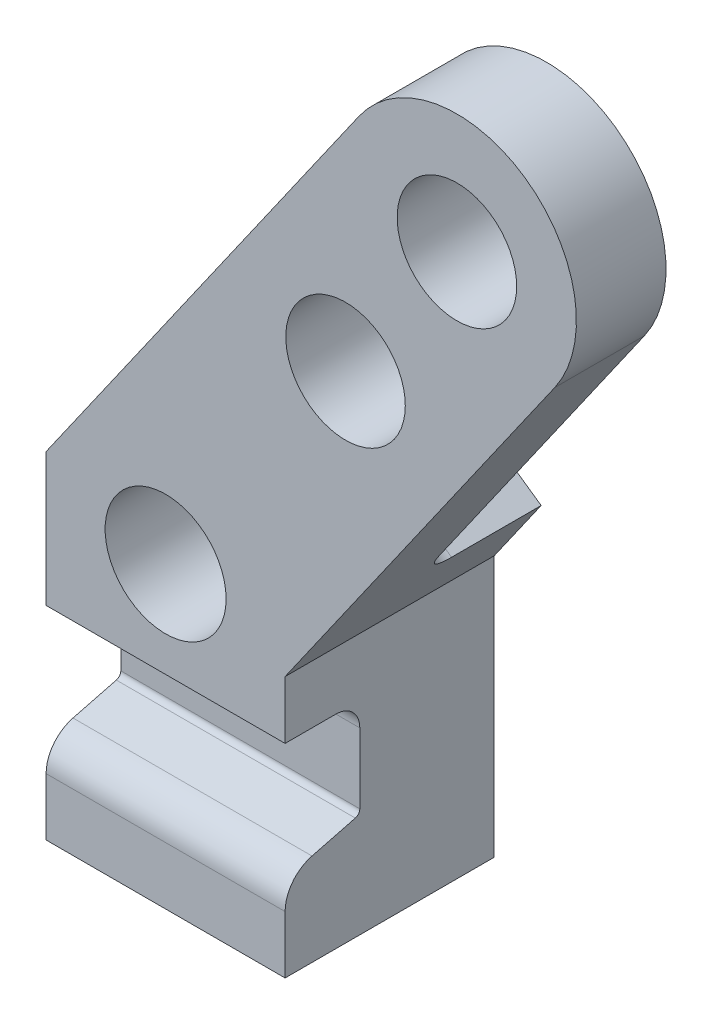
ISO-10303-21;
HEADER;
FILE_DESCRIPTION(('STEP AP214'),'2;1');
FILE_NAME('part.step','',(''),(''),'','','');
FILE_SCHEMA(('AUTOMOTIVE_DESIGN { 1 0 10303 214 1 1 1 1 }'));
ENDSEC;
DATA;
#1=APPLICATION_CONTEXT('core data for automotive mechanical design processes');
#2=APPLICATION_PROTOCOL_DEFINITION('international standard','automotive_design',2000,#1);
#3=PRODUCT_CONTEXT('',#1,'mechanical');
#4=PRODUCT('Part','Part','',(#3));
#5=PRODUCT_RELATED_PRODUCT_CATEGORY('part','',(#4));
#6=PRODUCT_DEFINITION_FORMATION('','',#4);
#7=PRODUCT_DEFINITION_CONTEXT('part definition',#1,'design');
#8=PRODUCT_DEFINITION('design','',#6,#7);
#9=PRODUCT_DEFINITION_SHAPE('','',#8);
#10=(LENGTH_UNIT() NAMED_UNIT(*) SI_UNIT(.MILLI.,.METRE.));
#11=(NAMED_UNIT(*) PLANE_ANGLE_UNIT() SI_UNIT($,.RADIAN.));
#12=(NAMED_UNIT(*) SI_UNIT($,.STERADIAN.) SOLID_ANGLE_UNIT());
#13=UNCERTAINTY_MEASURE_WITH_UNIT(LENGTH_MEASURE(1.E-05),#10,'distance_accuracy_value','');
#14=(GEOMETRIC_REPRESENTATION_CONTEXT(3) GLOBAL_UNCERTAINTY_ASSIGNED_CONTEXT((#13)) GLOBAL_UNIT_ASSIGNED_CONTEXT((#10,
#11,#12)) REPRESENTATION_CONTEXT('',''));
#15=CARTESIAN_POINT('',(0.,0.,0.));
#16=DIRECTION('',(0.,0.,1.));
#17=DIRECTION('',(1.,0.,0.));
#18=AXIS2_PLACEMENT_3D('',#15,#16,#17);
#19=CARTESIAN_POINT('',(97.5079941796775,139.255847529129,70.));
#20=DIRECTION('',(0.,0.,-1.));
#21=DIRECTION('',(-1.,0.,0.));
#22=AXIS2_PLACEMENT_3D('',#19,#20,#21);
#23=PLANE('',#22);
#24=DIRECTION('',(0.,1.,0.));
#25=VECTOR('',#24,1.);
#26=CARTESIAN_POINT('',(40.,-100.,70.));
#27=LINE('',#26,#25);
#28=CARTESIAN_POINT('',(40.,-100.,70.));
#29=VERTEX_POINT('',#28);
#30=CARTESIAN_POINT('',(40.,-80.7501322745768,70.));
#31=VERTEX_POINT('',#30);
#32=EDGE_CURVE('E181',#29,#31,#27,.T.);
#33=ORIENTED_EDGE('',*,*,#32,.T.);
#34=DIRECTION('',(-1.,0.,0.));
#35=VECTOR('',#34,1.);
#36=CARTESIAN_POINT('',(97.5079941796775,-80.7501322745768,70.));
#37=LINE('',#36,#35);
#38=CARTESIAN_POINT('',(-40.,-80.7501322745768,70.));
#39=VERTEX_POINT('',#38);
#40=EDGE_CURVE('E226',#31,#39,#37,.T.);
#41=ORIENTED_EDGE('',*,*,#40,.T.);
#42=DIRECTION('',(0.,-1.,0.));
#43=VECTOR('',#42,1.);
#44=CARTESIAN_POINT('',(-40.,12.6119515551592,70.));
#45=LINE('',#44,#43);
#46=CARTESIAN_POINT('',(-40.,-100.,70.));
#47=VERTEX_POINT('',#46);
#48=EDGE_CURVE('E174',#39,#47,#45,.T.);
#49=ORIENTED_EDGE('',*,*,#48,.T.);
#50=DIRECTION('',(1.,0.,0.));
#51=VECTOR('',#50,1.);
#52=CARTESIAN_POINT('',(-40.,-100.,70.));
#53=LINE('',#52,#51);
#54=EDGE_CURVE('E173',#47,#29,#53,.T.);
#55=ORIENTED_EDGE('',*,*,#54,.T.);
#56=EDGE_LOOP('',(#33,#41,#49,#55));
#57=FACE_BOUND('',#56,.T.);
#58=ADVANCED_FACE('F34',(#57),#23,.F.);
#59=CARTESIAN_POINT('',(97.5079941796775,139.255847529129,0.));
#60=DIRECTION('',(0.,0.,-1.));
#61=DIRECTION('',(-1.,0.,0.));
#62=AXIS2_PLACEMENT_3D('',#59,#60,#61);
#63=PLANE('',#62);
#64=CARTESIAN_POINT('',(0.,0.,0.));
#65=DIRECTION('',(0.,0.,1.));
#66=DIRECTION('',(1.,0.,0.));
#67=AXIS2_PLACEMENT_3D('',#64,#65,#66);
#68=CIRCLE('',#67,20.25);
#69=CARTESIAN_POINT('',(20.25,0.,0.));
#70=VERTEX_POINT('',#69);
#71=EDGE_CURVE('E288',#70,#70,#68,.T.);
#72=ORIENTED_EDGE('',*,*,#71,.T.);
#73=EDGE_LOOP('',(#72));
#74=FACE_BOUND('',#73,.T.);
#75=DIRECTION('',(-0.573576436351044,-0.819152044288993,0.));
#76=VECTOR('',#75,1.);
#77=CARTESIAN_POINT('',(64.7419124081177,162.198904983171,0.));
#78=LINE('',#77,#76);
#79=CARTESIAN_POINT('',(-9.823024317518,55.7091392256015,0.));
#80=VERTEX_POINT('',#79);
#81=CARTESIAN_POINT('',(-40.,12.6119515551592,0.));
#82=VERTEX_POINT('',#81);
#83=EDGE_CURVE('E187',#80,#82,#78,.T.);
#84=ORIENTED_EDGE('',*,*,#83,.F.);
#85=DIRECTION('',(0.819152044288994,-0.573576436351044,0.));
#86=VECTOR('',#85,1.);
#87=CARTESIAN_POINT('',(-9.823024317518,55.7091392256015,0.));
#88=LINE('',#87,#86);
#89=CARTESIAN_POINT('',(55.7091392256015,9.82302431751797,0.));
#90=VERTEX_POINT('',#89);
#91=EDGE_CURVE('E155',#80,#90,#88,.T.);
#92=ORIENTED_EDGE('',*,*,#91,.T.);
#93=DIRECTION('',(0.573576436351044,0.819152044288993,0.));
#94=VECTOR('',#93,1.);
#95=CARTESIAN_POINT('',(130.274075951237,116.312790075087,0.));
#96=LINE('',#95,#94);
#97=CARTESIAN_POINT('',(40.,-12.6119515551593,0.));
#98=VERTEX_POINT('',#97);
#99=EDGE_CURVE('E196',#98,#90,#96,.T.);
#100=ORIENTED_EDGE('',*,*,#99,.F.);
#101=DIRECTION('',(0.,1.,0.));
#102=VECTOR('',#101,1.);
#103=CARTESIAN_POINT('',(40.,-100.,0.));
#104=LINE('',#103,#102);
#105=CARTESIAN_POINT('',(40.,-100.,0.));
#106=VERTEX_POINT('',#105);
#107=EDGE_CURVE('E194',#106,#98,#104,.T.);
#108=ORIENTED_EDGE('',*,*,#107,.F.);
#109=DIRECTION('',(1.,0.,0.));
#110=VECTOR('',#109,1.);
#111=CARTESIAN_POINT('',(-40.,-100.,0.));
#112=LINE('',#111,#110);
#113=CARTESIAN_POINT('',(-40.,-100.,0.));
#114=VERTEX_POINT('',#113);
#115=EDGE_CURVE('E192',#114,#106,#112,.T.);
#116=ORIENTED_EDGE('',*,*,#115,.F.);
#117=DIRECTION('',(0.,-1.,0.));
#118=VECTOR('',#117,1.);
#119=CARTESIAN_POINT('',(-40.,12.6119515551592,0.));
#120=LINE('',#119,#118);
#121=EDGE_CURVE('E189',#82,#114,#120,.T.);
#122=ORIENTED_EDGE('',*,*,#121,.F.);
#123=EDGE_LOOP('',(#84,#92,#100,#108,#116,#122));
#124=FACE_BOUND('',#123,.T.);
#125=ADVANCED_FACE('F306',(#74,#124),#63,.T.);
#126=CARTESIAN_POINT('',(64.7419124081177,162.198904983171,70.));
#127=DIRECTION('',(0.819152044288993,-0.573576436351044,0.));
#128=DIRECTION('',(0.573576436351044,0.819152044288993,0.));
#129=AXIS2_PLACEMENT_3D('',#126,#127,#128);
#130=PLANE('',#129);
#131=DIRECTION('',(-0.573576436351044,-0.819152044288993,0.));
#132=VECTOR('',#131,1.);
#133=CARTESIAN_POINT('',(104.892262952691,219.5395480834,40.));
#134=LINE('',#133,#132);
#135=CARTESIAN_POINT('',(64.7419124081177,162.198904983171,40.));
#136=VERTEX_POINT('',#135);
#137=CARTESIAN_POINT('',(-4.08725995400756,63.9006596684914,40.));
#138=VERTEX_POINT('',#137);
#139=EDGE_CURVE('E273',#136,#138,#134,.T.);
#140=ORIENTED_EDGE('',*,*,#139,.T.);
#141=CARTESIAN_POINT('',(-4.08725995400754,63.9006596684914,30.));
#142=DIRECTION('',(0.819152044288993,-0.573576436351044,0.));
#143=DIRECTION('',(0.573576436351044,0.819152044288993,0.));
#144=AXIS2_PLACEMENT_3D('',#141,#142,#143);
#145=CIRCLE('',#144,10.);
#146=CARTESIAN_POINT('',(-9.823024317518,55.7091392256015,30.));
#147=VERTEX_POINT('',#146);
#148=EDGE_CURVE('E11',#138,#147,#145,.T.);
#149=ORIENTED_EDGE('',*,*,#148,.T.);
#150=DIRECTION('',(0.,0.,-1.));
#151=VECTOR('',#150,1.);
#152=CARTESIAN_POINT('',(-9.823024317518,55.7091392256015,40.));
#153=LINE('',#152,#151);
#154=EDGE_CURVE('E220',#147,#80,#153,.T.);
#155=ORIENTED_EDGE('',*,*,#154,.T.);
#156=ORIENTED_EDGE('',*,*,#83,.T.);
#157=DIRECTION('',(0.,0.,-1.));
#158=VECTOR('',#157,1.);
#159=CARTESIAN_POINT('',(-40.,12.6119515551592,70.));
#160=LINE('',#159,#158);
#161=CARTESIAN_POINT('',(-40.,12.6119515551592,70.));
#162=VERTEX_POINT('',#161);
#163=EDGE_CURVE('E211',#162,#82,#160,.T.);
#164=ORIENTED_EDGE('',*,*,#163,.F.);
#165=DIRECTION('',(-0.573576436351044,-0.819152044288993,0.));
#166=VECTOR('',#165,1.);
#167=CARTESIAN_POINT('',(64.7419124081177,162.198904983171,70.));
#168=LINE('',#167,#166);
#169=CARTESIAN_POINT('',(64.7419124081177,162.198904983171,70.));
#170=VERTEX_POINT('',#169);
#171=EDGE_CURVE('E171',#170,#162,#168,.T.);
#172=ORIENTED_EDGE('',*,*,#171,.F.);
#173=DIRECTION('',(0.,0.,-1.));
#174=VECTOR('',#173,1.);
#175=CARTESIAN_POINT('',(64.7419124081177,162.198904983171,70.));
#176=LINE('',#175,#174);
#177=EDGE_CURVE('E213',#170,#136,#176,.T.);
#178=ORIENTED_EDGE('',*,*,#177,.T.);
#179=EDGE_LOOP('',(#140,#149,#155,#156,#164,#172,#178));
#180=FACE_BOUND('',#179,.T.);
#181=ADVANCED_FACE('F300',(#180),#130,.F.);
#182=CARTESIAN_POINT('',(130.274075951237,116.312790075087,70.));
#183=DIRECTION('',(-0.819152044288993,0.573576436351044,0.));
#184=DIRECTION('',(-0.573576436351044,-0.819152044288993,0.));
#185=AXIS2_PLACEMENT_3D('',#182,#183,#184);
#186=PLANE('',#185);
#187=DIRECTION('',(0.,0.,-1.));
#188=VECTOR('',#187,1.);
#189=CARTESIAN_POINT('',(55.7091392256015,9.82302431751797,40.));
#190=LINE('',#189,#188);
#191=CARTESIAN_POINT('',(55.7091392256015,9.82302431751797,30.));
#192=VERTEX_POINT('',#191);
#193=EDGE_CURVE('E264',#192,#90,#190,.T.);
#194=ORIENTED_EDGE('',*,*,#193,.F.);
#195=CARTESIAN_POINT('',(61.444903589112,18.0145447604079,30.));
#196=DIRECTION('',(-0.819152044288993,0.573576436351044,0.));
#197=DIRECTION('',(-0.573576436351044,-0.819152044288993,0.));
#198=AXIS2_PLACEMENT_3D('',#195,#196,#197);
#199=CIRCLE('',#198,10.);
#200=CARTESIAN_POINT('',(61.4449035891119,18.0145447604079,40.));
#201=VERTEX_POINT('',#200);
#202=EDGE_CURVE('E42',#192,#201,#199,.T.);
#203=ORIENTED_EDGE('',*,*,#202,.T.);
#204=DIRECTION('',(0.573576436351044,0.819152044288993,0.));
#205=VECTOR('',#204,1.);
#206=CARTESIAN_POINT('',(55.7091392256015,9.82302431751797,40.));
#207=LINE('',#206,#205);
#208=CARTESIAN_POINT('',(130.274075951237,116.312790075087,40.));
#209=VERTEX_POINT('',#208);
#210=EDGE_CURVE('E270',#201,#209,#207,.T.);
#211=ORIENTED_EDGE('',*,*,#210,.T.);
#212=DIRECTION('',(0.,0.,-1.));
#213=VECTOR('',#212,1.);
#214=CARTESIAN_POINT('',(130.274075951237,116.312790075087,70.));
#215=LINE('',#214,#213);
#216=CARTESIAN_POINT('',(130.274075951237,116.312790075087,70.));
#217=VERTEX_POINT('',#216);
#218=EDGE_CURVE('E186',#217,#209,#215,.T.);
#219=ORIENTED_EDGE('',*,*,#218,.F.);
#220=DIRECTION('',(0.573576436351044,0.819152044288993,0.));
#221=VECTOR('',#220,1.);
#222=CARTESIAN_POINT('',(130.274075951237,116.312790075087,70.));
#223=LINE('',#222,#221);
#224=CARTESIAN_POINT('',(40.,-12.6119515551593,70.));
#225=VERTEX_POINT('',#224);
#226=EDGE_CURVE('E184',#225,#217,#223,.T.);
#227=ORIENTED_EDGE('',*,*,#226,.F.);
#228=DIRECTION('',(0.,0.,-1.));
#229=VECTOR('',#228,1.);
#230=CARTESIAN_POINT('',(40.,-12.6119515551593,70.));
#231=LINE('',#230,#229);
#232=EDGE_CURVE('E202',#225,#98,#231,.T.);
#233=ORIENTED_EDGE('',*,*,#232,.T.);
#234=ORIENTED_EDGE('',*,*,#99,.T.);
#235=EDGE_LOOP('',(#194,#203,#211,#219,#227,#233,#234));
#236=FACE_BOUND('',#235,.T.);
#237=ADVANCED_FACE('F268',(#236),#186,.F.);
#238=CARTESIAN_POINT('',(97.5079941796775,139.255847529129,70.));
#239=DIRECTION('',(0.,0.,1.));
#240=DIRECTION('',(1.,0.,0.));
#241=AXIS2_PLACEMENT_3D('',#238,#239,#240);
#242=CIRCLE('',#241,20.);
#243=CARTESIAN_POINT('',(117.507994179677,139.255847529129,70.));
#244=VERTEX_POINT('',#243);
#245=EDGE_CURVE('E285',#244,#244,#242,.T.);
#246=ORIENTED_EDGE('',*,*,#245,.F.);
#247=EDGE_LOOP('',(#246));
#248=FACE_BOUND('',#247,.T.);
#249=CARTESIAN_POINT('',(-40.,-32.,70.));
#250=VERTEX_POINT('',#249);
#251=EDGE_CURVE('E163',#162,#250,#45,.T.);
#252=ORIENTED_EDGE('',*,*,#251,.T.);
#253=DIRECTION('',(-1.,0.,0.));
#254=VECTOR('',#253,1.);
#255=CARTESIAN_POINT('',(137.507994179677,-32.,70.));
#256=LINE('',#255,#254);
#257=CARTESIAN_POINT('',(40.,-32.,70.));
#258=VERTEX_POINT('',#257);
#259=EDGE_CURVE('E145',#258,#250,#256,.T.);
#260=ORIENTED_EDGE('',*,*,#259,.F.);
#261=EDGE_CURVE('E176',#258,#225,#27,.T.);
#262=ORIENTED_EDGE('',*,*,#261,.T.);
#263=ORIENTED_EDGE('',*,*,#226,.T.);
#264=CARTESIAN_POINT('',(97.5079941796775,139.255847529129,70.));
#265=DIRECTION('',(0.,0.,1.));
#266=DIRECTION('',(-1.,0.,0.));
#267=AXIS2_PLACEMENT_3D('',#264,#265,#266);
#268=CIRCLE('',#267,40.);
#269=EDGE_CURVE('E199',#217,#170,#268,.T.);
#270=ORIENTED_EDGE('',*,*,#269,.T.);
#271=ORIENTED_EDGE('',*,*,#171,.T.);
#272=EDGE_LOOP('',(#252,#260,#262,#263,#270,#271));
#273=FACE_BOUND('',#272,.T.);
#274=CARTESIAN_POINT('',(0.,0.,70.));
#275=DIRECTION('',(0.,0.,1.));
#276=DIRECTION('',(1.,0.,0.));
#277=AXIS2_PLACEMENT_3D('',#274,#275,#276);
#278=CIRCLE('',#277,20.25);
#279=CARTESIAN_POINT('',(20.25,0.,70.));
#280=VERTEX_POINT('',#279);
#281=EDGE_CURVE('E190',#280,#280,#278,.T.);
#282=ORIENTED_EDGE('',*,*,#281,.F.);
#283=EDGE_LOOP('',(#282));
#284=FACE_BOUND('',#283,.T.);
#285=CARTESIAN_POINT('',(60.2255258168596,86.0109646503443,70.));
#286=DIRECTION('',(0.,0.,1.));
#287=DIRECTION('',(1.,0.,0.));
#288=AXIS2_PLACEMENT_3D('',#285,#286,#287);
#289=CIRCLE('',#288,20.);
#290=CARTESIAN_POINT('',(80.2255258168596,86.0109646503443,70.));
#291=VERTEX_POINT('',#290);
#292=EDGE_CURVE('E282',#291,#291,#289,.T.);
#293=ORIENTED_EDGE('',*,*,#292,.F.);
#294=EDGE_LOOP('',(#293));
#295=FACE_BOUND('',#294,.T.);
#296=ADVANCED_FACE('F168',(#248,#273,#284,#295),#23,.F.);
#297=CARTESIAN_POINT('',(97.5079941796775,139.255847529129,70.));
#298=DIRECTION('',(0.,0.,-1.));
#299=DIRECTION('',(-1.,0.,0.));
#300=AXIS2_PLACEMENT_3D('',#297,#298,#299);
#301=CYLINDRICAL_SURFACE('',#300,40.);
#302=ORIENTED_EDGE('',*,*,#218,.T.);
#303=CARTESIAN_POINT('',(97.5079941796775,139.255847529129,40.));
#304=DIRECTION('',(0.,0.,1.));
#305=DIRECTION('',(1.,0.,0.));
#306=AXIS2_PLACEMENT_3D('',#303,#304,#305);
#307=CIRCLE('',#306,40.);
#308=EDGE_CURVE('E279',#209,#136,#307,.T.);
#309=ORIENTED_EDGE('',*,*,#308,.T.);
#310=ORIENTED_EDGE('',*,*,#177,.F.);
#311=ORIENTED_EDGE('',*,*,#269,.F.);
#312=EDGE_LOOP('',(#302,#309,#310,#311));
#313=FACE_BOUND('',#312,.T.);
#314=ADVANCED_FACE('F297',(#313),#301,.T.);
#315=CARTESIAN_POINT('',(-40.,12.6119515551592,70.));
#316=DIRECTION('',(1.,0.,0.));
#317=DIRECTION('',(0.,1.,0.));
#318=AXIS2_PLACEMENT_3D('',#315,#316,#317);
#319=PLANE('',#318);
#320=ORIENTED_EDGE('',*,*,#48,.F.);
#321=CARTESIAN_POINT('',(-40.,-80.7501322745768,58.));
#322=DIRECTION('',(1.,0.,0.));
#323=DIRECTION('',(0.,1.,0.));
#324=AXIS2_PLACEMENT_3D('',#321,#322,#323);
#325=CIRCLE('',#324,12.);
#326=CARTESIAN_POINT('',(-40.,-69.1311822359546,61.));
#327=VERTEX_POINT('',#326);
#328=EDGE_CURVE('E229',#39,#327,#325,.F.);
#329=ORIENTED_EDGE('',*,*,#328,.T.);
#330=DIRECTION('',(0.,-0.250000000000001,0.968245836551854));
#331=VECTOR('',#330,1.);
#332=CARTESIAN_POINT('',(-40.,-65.,45.));
#333=LINE('',#332,#331);
#334=CARTESIAN_POINT('',(-40.,-65.3872983346207,46.5));
#335=VERTEX_POINT('',#334);
#336=EDGE_CURVE('E156',#335,#327,#333,.T.);
#337=ORIENTED_EDGE('',*,*,#336,.F.);
#338=CARTESIAN_POINT('',(-40.,-63.450806661517,47.));
#339=DIRECTION('',(1.,0.,0.));
#340=DIRECTION('',(0.,1.,0.));
#341=AXIS2_PLACEMENT_3D('',#338,#339,#340);
#342=CIRCLE('',#341,2.);
#343=CARTESIAN_POINT('',(-40.,-63.450806661517,45.));
#344=VERTEX_POINT('',#343);
#345=EDGE_CURVE('E243',#335,#344,#342,.T.);
#346=ORIENTED_EDGE('',*,*,#345,.T.);
#347=DIRECTION('',(0.,-1.,0.));
#348=VECTOR('',#347,1.);
#349=CARTESIAN_POINT('',(-40.,-32.,45.));
#350=LINE('',#349,#348);
#351=CARTESIAN_POINT('',(-40.,-40.,45.));
#352=VERTEX_POINT('',#351);
#353=EDGE_CURVE('E166',#352,#344,#350,.T.);
#354=ORIENTED_EDGE('',*,*,#353,.F.);
#355=CARTESIAN_POINT('',(-40.,-40.,53.));
#356=DIRECTION('',(1.,0.,0.));
#357=DIRECTION('',(0.,1.,0.));
#358=AXIS2_PLACEMENT_3D('',#355,#356,#357);
#359=CIRCLE('',#358,8.);
#360=CARTESIAN_POINT('',(-40.,-32.,53.));
#361=VERTEX_POINT('',#360);
#362=EDGE_CURVE('E165',#352,#361,#359,.T.);
#363=ORIENTED_EDGE('',*,*,#362,.T.);
#364=DIRECTION('',(0.,0.,-1.));
#365=VECTOR('',#364,1.);
#366=CARTESIAN_POINT('',(-40.,-32.,70.));
#367=LINE('',#366,#365);
#368=EDGE_CURVE('E148',#250,#361,#367,.T.);
#369=ORIENTED_EDGE('',*,*,#368,.F.);
#370=ORIENTED_EDGE('',*,*,#251,.F.);
#371=ORIENTED_EDGE('',*,*,#163,.T.);
#372=ORIENTED_EDGE('',*,*,#121,.T.);
#373=DIRECTION('',(0.,0.,-1.));
#374=VECTOR('',#373,1.);
#375=CARTESIAN_POINT('',(-40.,-100.,70.));
#376=LINE('',#375,#374);
#377=EDGE_CURVE('E208',#47,#114,#376,.T.);
#378=ORIENTED_EDGE('',*,*,#377,.F.);
#379=EDGE_LOOP('',(#320,#329,#337,#346,#354,#363,#369,#370,#371,#372,#378));
#380=FACE_BOUND('',#379,.T.);
#381=ADVANCED_FACE('F161',(#380),#319,.F.);
#382=CARTESIAN_POINT('',(-40.,-100.,70.));
#383=DIRECTION('',(0.,1.,0.));
#384=DIRECTION('',(0.,0.,1.));
#385=AXIS2_PLACEMENT_3D('',#382,#383,#384);
#386=PLANE('',#385);
#387=ORIENTED_EDGE('',*,*,#115,.T.);
#388=DIRECTION('',(0.,0.,-1.));
#389=VECTOR('',#388,1.);
#390=CARTESIAN_POINT('',(40.,-100.,70.));
#391=LINE('',#390,#389);
#392=EDGE_CURVE('E205',#29,#106,#391,.T.);
#393=ORIENTED_EDGE('',*,*,#392,.F.);
#394=ORIENTED_EDGE('',*,*,#54,.F.);
#395=ORIENTED_EDGE('',*,*,#377,.T.);
#396=EDGE_LOOP('',(#387,#393,#394,#395));
#397=FACE_BOUND('',#396,.T.);
#398=ADVANCED_FACE('F310',(#397),#386,.F.);
#399=CARTESIAN_POINT('',(40.,-100.,70.));
#400=DIRECTION('',(-1.,0.,0.));
#401=DIRECTION('',(0.,-1.,0.));
#402=AXIS2_PLACEMENT_3D('',#399,#400,#401);
#403=PLANE('',#402);
#404=DIRECTION('',(0.,0.,-1.));
#405=VECTOR('',#404,1.);
#406=CARTESIAN_POINT('',(40.,-32.,70.));
#407=LINE('',#406,#405);
#408=CARTESIAN_POINT('',(40.,-32.,53.));
#409=VERTEX_POINT('',#408);
#410=EDGE_CURVE('E151',#258,#409,#407,.T.);
#411=ORIENTED_EDGE('',*,*,#410,.T.);
#412=CARTESIAN_POINT('',(40.,-40.,53.));
#413=DIRECTION('',(-1.,0.,0.));
#414=DIRECTION('',(0.,-1.,0.));
#415=AXIS2_PLACEMENT_3D('',#412,#413,#414);
#416=CIRCLE('',#415,8.);
#417=CARTESIAN_POINT('',(40.,-40.,45.));
#418=VERTEX_POINT('',#417);
#419=EDGE_CURVE('E254',#409,#418,#416,.T.);
#420=ORIENTED_EDGE('',*,*,#419,.T.);
#421=DIRECTION('',(0.,-1.,0.));
#422=VECTOR('',#421,1.);
#423=CARTESIAN_POINT('',(40.,-100.,45.));
#424=LINE('',#423,#422);
#425=CARTESIAN_POINT('',(40.,-63.450806661517,45.));
#426=VERTEX_POINT('',#425);
#427=EDGE_CURVE('E222',#418,#426,#424,.T.);
#428=ORIENTED_EDGE('',*,*,#427,.T.);
#429=CARTESIAN_POINT('',(40.,-63.450806661517,47.));
#430=DIRECTION('',(-1.,0.,0.));
#431=DIRECTION('',(0.,-1.,0.));
#432=AXIS2_PLACEMENT_3D('',#429,#430,#431);
#433=CIRCLE('',#432,2.);
#434=CARTESIAN_POINT('',(40.,-65.3872983346207,46.5));
#435=VERTEX_POINT('',#434);
#436=EDGE_CURVE('E246',#426,#435,#433,.T.);
#437=ORIENTED_EDGE('',*,*,#436,.T.);
#438=DIRECTION('',(0.,-0.250000000000001,0.968245836551854));
#439=VECTOR('',#438,1.);
#440=CARTESIAN_POINT('',(40.,-73.2390364784491,76.9096510698288));
#441=LINE('',#440,#439);
#442=CARTESIAN_POINT('',(40.,-69.1311822359546,61.));
#443=VERTEX_POINT('',#442);
#444=EDGE_CURVE('E224',#435,#443,#441,.T.);
#445=ORIENTED_EDGE('',*,*,#444,.T.);
#446=CARTESIAN_POINT('',(40.,-80.7501322745768,58.));
#447=DIRECTION('',(-1.,0.,0.));
#448=DIRECTION('',(0.,-1.,0.));
#449=AXIS2_PLACEMENT_3D('',#446,#447,#448);
#450=CIRCLE('',#449,12.);
#451=EDGE_CURVE('E235',#443,#31,#450,.F.);
#452=ORIENTED_EDGE('',*,*,#451,.T.);
#453=ORIENTED_EDGE('',*,*,#32,.F.);
#454=ORIENTED_EDGE('',*,*,#392,.T.);
#455=ORIENTED_EDGE('',*,*,#107,.T.);
#456=ORIENTED_EDGE('',*,*,#232,.F.);
#457=ORIENTED_EDGE('',*,*,#261,.F.);
#458=EDGE_LOOP('',(#411,#420,#428,#437,#445,#452,#453,#454,#455,#456,#457));
#459=FACE_BOUND('',#458,.T.);
#460=ADVANCED_FACE('F314',(#459),#403,.F.);
#461=CARTESIAN_POINT('',(0.,0.,70.));
#462=DIRECTION('',(0.,0.,-1.));
#463=DIRECTION('',(-1.,0.,0.));
#464=AXIS2_PLACEMENT_3D('',#461,#462,#463);
#465=CYLINDRICAL_SURFACE('',#464,20.25);
#466=ORIENTED_EDGE('',*,*,#281,.T.);
#467=EDGE_LOOP('',(#466));
#468=FACE_BOUND('',#467,.T.);
#469=ORIENTED_EDGE('',*,*,#71,.F.);
#470=EDGE_LOOP('',(#469));
#471=FACE_BOUND('',#470,.T.);
#472=ADVANCED_FACE('F371',(#468,#471),#465,.F.);
#473=CARTESIAN_POINT('',(97.5079941796775,139.255847529129,70.));
#474=DIRECTION('',(0.,0.,-1.));
#475=DIRECTION('',(-1.,0.,0.));
#476=AXIS2_PLACEMENT_3D('',#473,#474,#475);
#477=CYLINDRICAL_SURFACE('',#476,20.);
#478=CARTESIAN_POINT('',(97.5079941796775,139.255847529129,40.));
#479=DIRECTION('',(0.,0.,1.));
#480=DIRECTION('',(1.,0.,0.));
#481=AXIS2_PLACEMENT_3D('',#478,#479,#480);
#482=CIRCLE('',#481,20.);
#483=CARTESIAN_POINT('',(117.507994179677,139.255847529129,40.));
#484=VERTEX_POINT('',#483);
#485=EDGE_CURVE('E219',#484,#484,#482,.T.);
#486=ORIENTED_EDGE('',*,*,#485,.F.);
#487=EDGE_LOOP('',(#486));
#488=FACE_BOUND('',#487,.T.);
#489=ORIENTED_EDGE('',*,*,#245,.T.);
#490=EDGE_LOOP('',(#489));
#491=FACE_BOUND('',#490,.T.);
#492=ADVANCED_FACE('F347',(#488,#491),#477,.F.);
#493=CARTESIAN_POINT('',(60.2255258168596,86.0109646503443,70.));
#494=DIRECTION('',(0.,0.,-1.));
#495=DIRECTION('',(-1.,0.,0.));
#496=AXIS2_PLACEMENT_3D('',#493,#494,#495);
#497=CYLINDRICAL_SURFACE('',#496,20.);
#498=CARTESIAN_POINT('',(60.2255258168596,86.0109646503443,40.));
#499=DIRECTION('',(0.,0.,1.));
#500=DIRECTION('',(1.,0.,0.));
#501=AXIS2_PLACEMENT_3D('',#498,#499,#500);
#502=CIRCLE('',#501,20.);
#503=CARTESIAN_POINT('',(80.2255258168596,86.0109646503443,40.));
#504=VERTEX_POINT('',#503);
#505=EDGE_CURVE('E216',#504,#504,#502,.T.);
#506=ORIENTED_EDGE('',*,*,#505,.F.);
#507=EDGE_LOOP('',(#506));
#508=FACE_BOUND('',#507,.T.);
#509=ORIENTED_EDGE('',*,*,#292,.T.);
#510=EDGE_LOOP('',(#509));
#511=FACE_BOUND('',#510,.T.);
#512=ADVANCED_FACE('F338',(#508,#511),#497,.F.);
#513=CARTESIAN_POINT('',(0.,0.,40.));
#514=DIRECTION('',(0.,0.,1.));
#515=DIRECTION('',(1.,0.,0.));
#516=AXIS2_PLACEMENT_3D('',#513,#514,#515);
#517=PLANE('',#516);
#518=ORIENTED_EDGE('',*,*,#505,.T.);
#519=EDGE_LOOP('',(#518));
#520=FACE_BOUND('',#519,.T.);
#521=ORIENTED_EDGE('',*,*,#485,.T.);
#522=EDGE_LOOP('',(#521));
#523=FACE_BOUND('',#522,.T.);
#524=ORIENTED_EDGE('',*,*,#210,.F.);
#525=DIRECTION('',(0.819152044288994,-0.573576436351044,0.));
#526=VECTOR('',#525,1.);
#527=CARTESIAN_POINT('',(28.6788218175522,40.9576022144497,40.));
#528=LINE('',#527,#526);
#529=EDGE_CURVE('E49',#201,#138,#528,.F.);
#530=ORIENTED_EDGE('',*,*,#529,.T.);
#531=ORIENTED_EDGE('',*,*,#139,.F.);
#532=ORIENTED_EDGE('',*,*,#308,.F.);
#533=EDGE_LOOP('',(#524,#530,#531,#532));
#534=FACE_BOUND('',#533,.T.);
#535=ADVANCED_FACE('F336',(#520,#523,#534),#517,.F.);
#536=CARTESIAN_POINT('',(-9.823024317518,55.7091392256015,40.));
#537=DIRECTION('',(0.573576436351044,0.819152044288994,0.));
#538=DIRECTION('',(-0.819152044288994,0.573576436351044,0.));
#539=AXIS2_PLACEMENT_3D('',#536,#537,#538);
#540=PLANE('',#539);
#541=ORIENTED_EDGE('',*,*,#154,.F.);
#542=DIRECTION('',(0.819152044288994,-0.573576436351044,0.));
#543=VECTOR('',#542,1.);
#544=CARTESIAN_POINT('',(-9.823024317518,55.7091392256015,30.));
#545=LINE('',#544,#543);
#546=EDGE_CURVE('E256',#147,#192,#545,.T.);
#547=ORIENTED_EDGE('',*,*,#546,.T.);
#548=ORIENTED_EDGE('',*,*,#193,.T.);
#549=ORIENTED_EDGE('',*,*,#91,.F.);
#550=EDGE_LOOP('',(#541,#547,#548,#549));
#551=FACE_BOUND('',#550,.T.);
#552=ADVANCED_FACE('F262',(#551),#540,.T.);
#553=CARTESIAN_POINT('',(137.507994179677,-65.,45.));
#554=DIRECTION('',(0.,-0.968245836551854,-0.250000000000001));
#555=DIRECTION('',(0.,0.250000000000001,-0.968245836551854));
#556=AXIS2_PLACEMENT_3D('',#553,#554,#555);
#557=PLANE('',#556);
#558=ORIENTED_EDGE('',*,*,#444,.F.);
#559=DIRECTION('',(-1.,0.,0.));
#560=VECTOR('',#559,1.);
#561=CARTESIAN_POINT('',(-39.9999999999999,-65.3872983346207,46.5));
#562=LINE('',#561,#560);
#563=EDGE_CURVE('E237',#435,#335,#562,.T.);
#564=ORIENTED_EDGE('',*,*,#563,.T.);
#565=ORIENTED_EDGE('',*,*,#336,.T.);
#566=DIRECTION('',(-1.,0.,0.));
#567=VECTOR('',#566,1.);
#568=CARTESIAN_POINT('',(137.507994179677,-69.1311822359546,61.));
#569=LINE('',#568,#567);
#570=EDGE_CURVE('E232',#327,#443,#569,.F.);
#571=ORIENTED_EDGE('',*,*,#570,.T.);
#572=EDGE_LOOP('',(#558,#564,#565,#571));
#573=FACE_BOUND('',#572,.T.);
#574=ADVANCED_FACE('F345',(#573),#557,.F.);
#575=CARTESIAN_POINT('',(137.507994179677,-32.,45.));
#576=DIRECTION('',(0.,0.,-1.));
#577=DIRECTION('',(0.,1.,0.));
#578=AXIS2_PLACEMENT_3D('',#575,#576,#577);
#579=PLANE('',#578);
#580=ORIENTED_EDGE('',*,*,#427,.F.);
#581=DIRECTION('',(-1.,0.,0.));
#582=VECTOR('',#581,1.);
#583=CARTESIAN_POINT('',(-40.,-40.,45.));
#584=LINE('',#583,#582);
#585=EDGE_CURVE('E248',#418,#352,#584,.T.);
#586=ORIENTED_EDGE('',*,*,#585,.T.);
#587=ORIENTED_EDGE('',*,*,#353,.T.);
#588=DIRECTION('',(-1.,0.,0.));
#589=VECTOR('',#588,1.);
#590=CARTESIAN_POINT('',(40.,-63.450806661517,45.));
#591=LINE('',#590,#589);
#592=EDGE_CURVE('E240',#344,#426,#591,.F.);
#593=ORIENTED_EDGE('',*,*,#592,.T.);
#594=EDGE_LOOP('',(#580,#586,#587,#593));
#595=FACE_BOUND('',#594,.T.);
#596=ADVANCED_FACE('F330',(#595),#579,.F.);
#597=CARTESIAN_POINT('',(137.507994179677,-32.,70.));
#598=DIRECTION('',(0.,1.,0.));
#599=DIRECTION('',(0.,0.,1.));
#600=AXIS2_PLACEMENT_3D('',#597,#598,#599);
#601=PLANE('',#600);
#602=ORIENTED_EDGE('',*,*,#368,.T.);
#603=DIRECTION('',(-1.,0.,0.));
#604=VECTOR('',#603,1.);
#605=CARTESIAN_POINT('',(40.,-32.,53.));
#606=LINE('',#605,#604);
#607=EDGE_CURVE('E251',#361,#409,#606,.F.);
#608=ORIENTED_EDGE('',*,*,#607,.T.);
#609=ORIENTED_EDGE('',*,*,#410,.F.);
#610=ORIENTED_EDGE('',*,*,#259,.T.);
#611=EDGE_LOOP('',(#602,#608,#609,#610));
#612=FACE_BOUND('',#611,.T.);
#613=ADVANCED_FACE('F147',(#612),#601,.F.);
#614=CARTESIAN_POINT('',(97.5079941796775,-80.7501322745768,58.));
#615=DIRECTION('',(-1.,0.,0.));
#616=DIRECTION('',(0.,-1.,0.));
#617=AXIS2_PLACEMENT_3D('',#614,#615,#616);
#618=CYLINDRICAL_SURFACE('',#617,12.);
#619=ORIENTED_EDGE('',*,*,#451,.F.);
#620=ORIENTED_EDGE('',*,*,#570,.F.);
#621=ORIENTED_EDGE('',*,*,#328,.F.);
#622=ORIENTED_EDGE('',*,*,#40,.F.);
#623=EDGE_LOOP('',(#619,#620,#621,#622));
#624=FACE_BOUND('',#623,.T.);
#625=ADVANCED_FACE('F320',(#624),#618,.T.);
#626=CARTESIAN_POINT('',(137.507994179677,-63.450806661517,47.));
#627=DIRECTION('',(1.,0.,0.));
#628=DIRECTION('',(0.,1.,0.));
#629=AXIS2_PLACEMENT_3D('',#626,#627,#628);
#630=CYLINDRICAL_SURFACE('',#629,2.);
#631=ORIENTED_EDGE('',*,*,#436,.F.);
#632=ORIENTED_EDGE('',*,*,#592,.F.);
#633=ORIENTED_EDGE('',*,*,#345,.F.);
#634=ORIENTED_EDGE('',*,*,#563,.F.);
#635=EDGE_LOOP('',(#631,#632,#633,#634));
#636=FACE_BOUND('',#635,.T.);
#637=ADVANCED_FACE('F400',(#636),#630,.F.);
#638=CARTESIAN_POINT('',(137.507994179677,-40.,53.));
#639=DIRECTION('',(1.,0.,0.));
#640=DIRECTION('',(0.,1.,0.));
#641=AXIS2_PLACEMENT_3D('',#638,#639,#640);
#642=CYLINDRICAL_SURFACE('',#641,8.);
#643=ORIENTED_EDGE('',*,*,#419,.F.);
#644=ORIENTED_EDGE('',*,*,#607,.F.);
#645=ORIENTED_EDGE('',*,*,#362,.F.);
#646=ORIENTED_EDGE('',*,*,#585,.F.);
#647=EDGE_LOOP('',(#643,#644,#645,#646));
#648=FACE_BOUND('',#647,.T.);
#649=ADVANCED_FACE('F335',(#648),#642,.F.);
#650=CARTESIAN_POINT('',(-4.08725995400756,63.9006596684914,30.));
#651=DIRECTION('',(0.819152044288994,-0.573576436351044,0.));
#652=DIRECTION('',(0.573576436351044,0.819152044288994,0.));
#653=AXIS2_PLACEMENT_3D('',#650,#651,#652);
#654=CYLINDRICAL_SURFACE('',#653,10.);
#655=ORIENTED_EDGE('',*,*,#148,.F.);
#656=ORIENTED_EDGE('',*,*,#529,.F.);
#657=ORIENTED_EDGE('',*,*,#202,.F.);
#658=ORIENTED_EDGE('',*,*,#546,.F.);
#659=EDGE_LOOP('',(#655,#656,#657,#658));
#660=FACE_BOUND('',#659,.T.);
#661=ADVANCED_FACE('F36',(#660),#654,.F.);
#662=CLOSED_SHELL('',(#58,#125,#181,#237,#296,#314,#381,#398,#460,#472,#492,#512,#535,#552,#574,
#596,#613,#625,#637,#649,#661));
#663=MANIFOLD_SOLID_BREP('B2',#662);
#664=ADVANCED_BREP_SHAPE_REPRESENTATION('',(#18,#663),#14);
#665=SHAPE_DEFINITION_REPRESENTATION(#9,#664);
ENDSEC;
END-ISO-10303-21;
